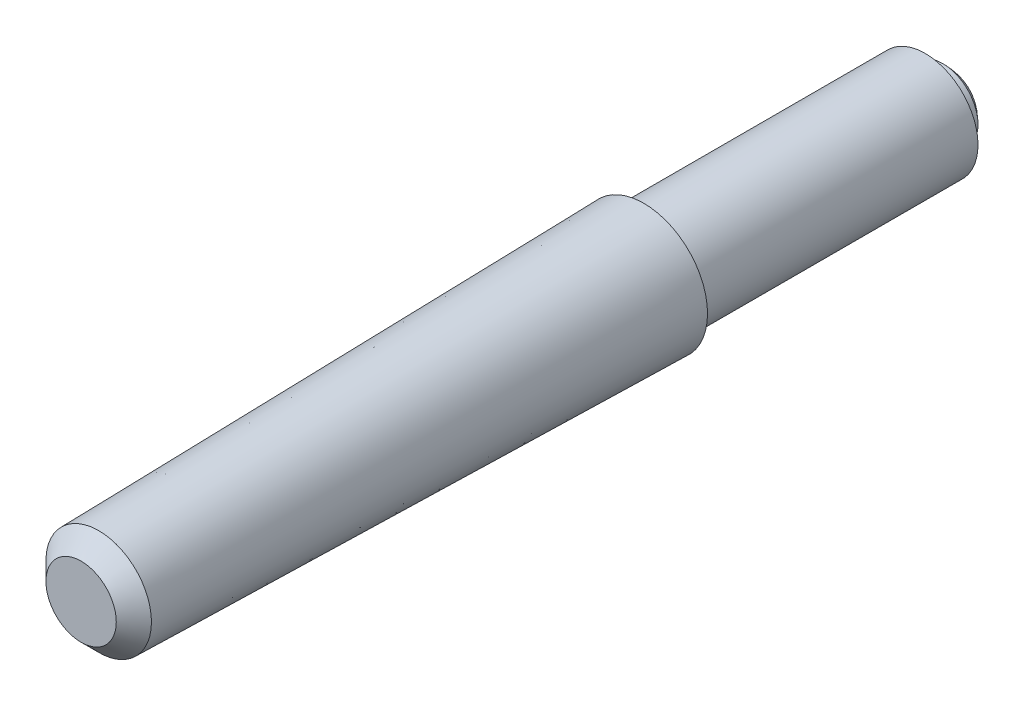
ISO-10303-21;
HEADER;
FILE_DESCRIPTION(('STEP AP214'),'2;1');
FILE_NAME('part.step','',(''),(''),'','','');
FILE_SCHEMA(('AUTOMOTIVE_DESIGN { 1 0 10303 214 1 1 1 1 }'));
ENDSEC;
DATA;
#1=APPLICATION_CONTEXT('core data for automotive mechanical design processes');
#2=APPLICATION_PROTOCOL_DEFINITION('international standard','automotive_design',2000,#1);
#3=PRODUCT_CONTEXT('',#1,'mechanical');
#4=PRODUCT('Part','Part','',(#3));
#5=PRODUCT_RELATED_PRODUCT_CATEGORY('part','',(#4));
#6=PRODUCT_DEFINITION_FORMATION('','',#4);
#7=PRODUCT_DEFINITION_CONTEXT('part definition',#1,'design');
#8=PRODUCT_DEFINITION('design','',#6,#7);
#9=PRODUCT_DEFINITION_SHAPE('','',#8);
#10=(LENGTH_UNIT() NAMED_UNIT(*) SI_UNIT(.MILLI.,.METRE.));
#11=(NAMED_UNIT(*) PLANE_ANGLE_UNIT() SI_UNIT($,.RADIAN.));
#12=(NAMED_UNIT(*) SI_UNIT($,.STERADIAN.) SOLID_ANGLE_UNIT());
#13=UNCERTAINTY_MEASURE_WITH_UNIT(LENGTH_MEASURE(1.E-05),#10,'distance_accuracy_value','');
#14=(GEOMETRIC_REPRESENTATION_CONTEXT(3) GLOBAL_UNCERTAINTY_ASSIGNED_CONTEXT((#13)) GLOBAL_UNIT_ASSIGNED_CONTEXT((#10,
#11,#12)) REPRESENTATION_CONTEXT('',''));
#15=CARTESIAN_POINT('',(0.,0.,0.));
#16=DIRECTION('',(0.,0.,1.));
#17=DIRECTION('',(1.,0.,0.));
#18=AXIS2_PLACEMENT_3D('',#15,#16,#17);
#19=CARTESIAN_POINT('',(0.,0.,-10.6417859055441));
#20=CARTESIAN_POINT('',(0.,1.,-10.6417859055441));
#21=CARTESIAN_POINT('',(0.,2.,-9.64178590554413));
#22=B_SPLINE_CURVE_WITH_KNOTS('',2,(#19,#20,#21),.UNSPECIFIED.,.F.,.F.,(3,3),(0.,0.5),.UNSPECIFIED.);
#23=CARTESIAN_POINT('',(0.,0.,39.3582140944559));
#24=DIRECTION('',(0.,0.,1.));
#25=AXIS1_PLACEMENT('',#23,#24);
#26=SURFACE_OF_REVOLUTION('',#22,#25);
#27=CARTESIAN_POINT('',(0.,0.,-9.64178590554413));
#28=DIRECTION('',(0.,0.,1.));
#29=DIRECTION('',(1.,0.,0.));
#30=AXIS2_PLACEMENT_3D('',#27,#28,#29);
#31=CIRCLE('',#30,2.);
#32=CARTESIAN_POINT('',(2.,0.,-9.64178590554413));
#33=VERTEX_POINT('',#32);
#34=EDGE_CURVE('E11',#33,#33,#31,.T.);
#35=ORIENTED_EDGE('',*,*,#34,.F.);
#36=EDGE_LOOP('',(#35));
#37=FACE_BOUND('',#36,.T.);
#38=CARTESIAN_POINT('',(0.,0.,-10.6417859055441));
#39=VERTEX_POINT('',#38);
#40=VERTEX_LOOP('',#39);
#41=FACE_BOUND('',#40,.T.);
#42=ADVANCED_FACE('F47',(#37,#41),#26,.T.);
#43=CARTESIAN_POINT('',(0.,0.,39.3582140944559));
#44=DIRECTION('',(0.,0.,1.));
#45=DIRECTION('',(1.,0.,0.));
#46=AXIS2_PLACEMENT_3D('',#43,#44,#45);
#47=CYLINDRICAL_SURFACE('',#46,2.);
#48=CARTESIAN_POINT('',(0.,0.,-8.64178590554413));
#49=DIRECTION('',(0.,0.,1.));
#50=DIRECTION('',(1.,0.,0.));
#51=AXIS2_PLACEMENT_3D('',#48,#49,#50);
#52=CIRCLE('',#51,2.);
#53=CARTESIAN_POINT('',(2.,0.,-8.64178590554413));
#54=VERTEX_POINT('',#53);
#55=EDGE_CURVE('E55',#54,#54,#52,.T.);
#56=ORIENTED_EDGE('',*,*,#55,.F.);
#57=EDGE_LOOP('',(#56));
#58=FACE_BOUND('',#57,.T.);
#59=ORIENTED_EDGE('',*,*,#34,.T.);
#60=EDGE_LOOP('',(#59));
#61=FACE_BOUND('',#60,.T.);
#62=ADVANCED_FACE('F59',(#58,#61),#47,.T.);
#63=CARTESIAN_POINT('',(0.,3.,-8.64178590554413));
#64=DIRECTION('',(0.,0.,1.));
#65=DIRECTION('',(1.,0.,0.));
#66=AXIS2_PLACEMENT_3D('',#63,#64,#65);
#67=PLANE('',#66);
#68=CARTESIAN_POINT('',(0.,0.,-8.64178590554413));
#69=DIRECTION('',(0.,0.,1.));
#70=DIRECTION('',(1.,0.,0.));
#71=AXIS2_PLACEMENT_3D('',#68,#69,#70);
#72=CIRCLE('',#71,3.);
#73=CARTESIAN_POINT('',(3.,0.,-8.64178590554413));
#74=VERTEX_POINT('',#73);
#75=EDGE_CURVE('E117',#74,#74,#72,.T.);
#76=ORIENTED_EDGE('',*,*,#75,.F.);
#77=EDGE_LOOP('',(#76));
#78=FACE_BOUND('',#77,.T.);
#79=ORIENTED_EDGE('',*,*,#55,.T.);
#80=EDGE_LOOP('',(#79));
#81=FACE_BOUND('',#80,.T.);
#82=ADVANCED_FACE('F64',(#78,#81),#67,.F.);
#83=CARTESIAN_POINT('',(0.,0.,39.3582140944559));
#84=DIRECTION('',(0.,0.,1.));
#85=DIRECTION('',(1.,0.,0.));
#86=AXIS2_PLACEMENT_3D('',#83,#84,#85);
#87=CYLINDRICAL_SURFACE('',#86,3.);
#88=CARTESIAN_POINT('',(0.,0.,7.35821409445588));
#89=DIRECTION('',(0.,0.,1.));
#90=DIRECTION('',(1.,0.,0.));
#91=AXIS2_PLACEMENT_3D('',#88,#89,#90);
#92=CIRCLE('',#91,3.);
#93=CARTESIAN_POINT('',(3.,0.,7.35821409445588));
#94=VERTEX_POINT('',#93);
#95=EDGE_CURVE('E113',#94,#94,#92,.T.);
#96=ORIENTED_EDGE('',*,*,#95,.F.);
#97=EDGE_LOOP('',(#96));
#98=FACE_BOUND('',#97,.T.);
#99=ORIENTED_EDGE('',*,*,#75,.T.);
#100=EDGE_LOOP('',(#99));
#101=FACE_BOUND('',#100,.T.);
#102=ADVANCED_FACE('F71',(#98,#101),#87,.T.);
#103=CARTESIAN_POINT('',(0.,3.62,7.35821409445588));
#104=DIRECTION('',(0.,0.,1.));
#105=DIRECTION('',(1.,0.,0.));
#106=AXIS2_PLACEMENT_3D('',#103,#104,#105);
#107=PLANE('',#106);
#108=CARTESIAN_POINT('',(0.,0.,7.35821409445588));
#109=DIRECTION('',(0.,0.,1.));
#110=DIRECTION('',(1.,0.,0.));
#111=AXIS2_PLACEMENT_3D('',#108,#109,#110);
#112=CIRCLE('',#111,3.62);
#113=CARTESIAN_POINT('',(3.62,0.,7.35821409445588));
#114=VERTEX_POINT('',#113);
#115=EDGE_CURVE('E104',#114,#114,#112,.T.);
#116=ORIENTED_EDGE('',*,*,#115,.F.);
#117=EDGE_LOOP('',(#116));
#118=FACE_BOUND('',#117,.T.);
#119=ORIENTED_EDGE('',*,*,#95,.T.);
#120=EDGE_LOOP('',(#119));
#121=FACE_BOUND('',#120,.T.);
#122=ADVANCED_FACE('F78',(#118,#121),#107,.F.);
#123=CARTESIAN_POINT('',(0.,0.,7.35821409445588));
#124=DIRECTION('',(0.,0.,-1.));
#125=DIRECTION('',(-1.,0.,0.));
#126=AXIS2_PLACEMENT_3D('',#123,#124,#125);
#127=CONICAL_SURFACE('',#126,3.62,0.0199973339731507);
#128=CARTESIAN_POINT('',(0.,0.,38.3582140944559));
#129=DIRECTION('',(0.,0.,1.));
#130=DIRECTION('',(1.,0.,0.));
#131=AXIS2_PLACEMENT_3D('',#128,#129,#130);
#132=CIRCLE('',#131,2.99999999999999);
#133=CARTESIAN_POINT('',(2.99999999999999,0.,38.3582140944559));
#134=VERTEX_POINT('',#133);
#135=EDGE_CURVE('E100',#134,#134,#132,.T.);
#136=ORIENTED_EDGE('',*,*,#135,.F.);
#137=EDGE_LOOP('',(#136));
#138=FACE_BOUND('',#137,.T.);
#139=ORIENTED_EDGE('',*,*,#115,.T.);
#140=EDGE_LOOP('',(#139));
#141=FACE_BOUND('',#140,.T.);
#142=ADVANCED_FACE('F82',(#138,#141),#127,.T.);
#143=CARTESIAN_POINT('',(0.,0.,38.3582140944559));
#144=DIRECTION('',(0.,0.,-1.));
#145=DIRECTION('',(-1.,0.,0.));
#146=AXIS2_PLACEMENT_3D('',#143,#144,#145);
#147=CONICAL_SURFACE('',#146,2.99999999999999,0.785398163397448);
#148=CARTESIAN_POINT('',(0.,0.,39.3582140944559));
#149=DIRECTION('',(0.,0.,1.));
#150=DIRECTION('',(1.,0.,0.));
#151=AXIS2_PLACEMENT_3D('',#148,#149,#150);
#152=CIRCLE('',#151,1.99999999999999);
#153=CARTESIAN_POINT('',(1.99999999999999,0.,39.3582140944559));
#154=VERTEX_POINT('',#153);
#155=EDGE_CURVE('E98',#154,#154,#152,.T.);
#156=ORIENTED_EDGE('',*,*,#155,.F.);
#157=EDGE_LOOP('',(#156));
#158=FACE_BOUND('',#157,.T.);
#159=ORIENTED_EDGE('',*,*,#135,.T.);
#160=EDGE_LOOP('',(#159));
#161=FACE_BOUND('',#160,.T.);
#162=ADVANCED_FACE('F86',(#158,#161),#147,.T.);
#163=CARTESIAN_POINT('',(0.,0.,39.3582140944559));
#164=DIRECTION('',(0.,0.,-1.));
#165=DIRECTION('',(-1.,0.,0.));
#166=AXIS2_PLACEMENT_3D('',#163,#164,#165);
#167=PLANE('',#166);
#168=ORIENTED_EDGE('',*,*,#155,.T.);
#169=EDGE_LOOP('',(#168));
#170=FACE_BOUND('',#169,.T.);
#171=ADVANCED_FACE('F90',(#170),#167,.F.);
#172=CLOSED_SHELL('',(#42,#62,#82,#102,#122,#142,#162,#171));
#173=MANIFOLD_SOLID_BREP('B2',#172);
#174=ADVANCED_BREP_SHAPE_REPRESENTATION('',(#18,#173),#14);
#175=SHAPE_DEFINITION_REPRESENTATION(#9,#174);
ENDSEC;
END-ISO-10303-21;
